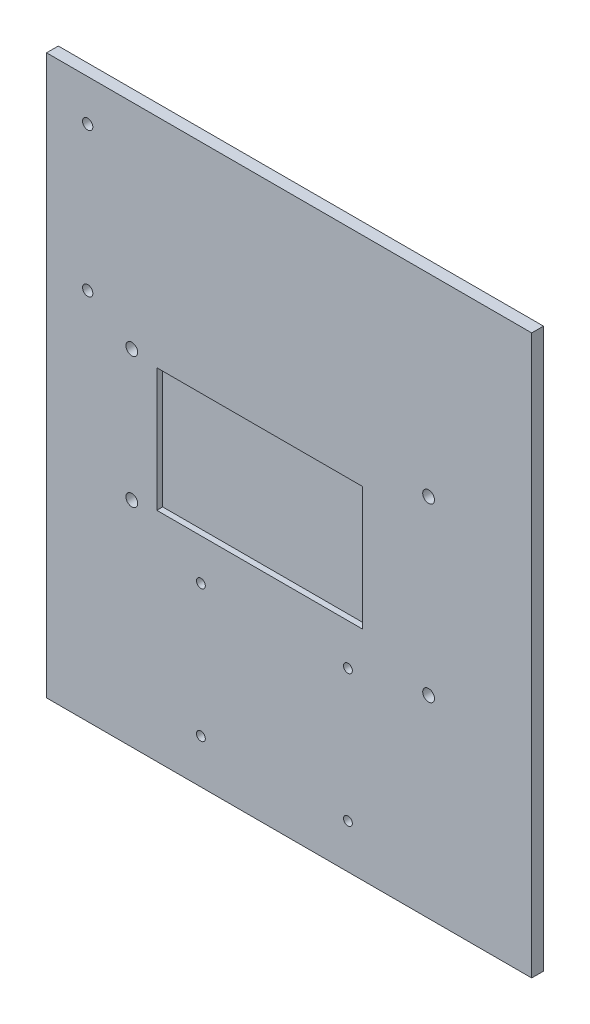
ISO-10303-21;
HEADER;
FILE_DESCRIPTION(('STEP AP214'),'2;1');
FILE_NAME('part.step','',(''),(''),'','','');
FILE_SCHEMA(('AUTOMOTIVE_DESIGN { 1 0 10303 214 1 1 1 1 }'));
ENDSEC;
DATA;
#1=APPLICATION_CONTEXT('core data for automotive mechanical design processes');
#2=APPLICATION_PROTOCOL_DEFINITION('international standard','automotive_design',2000,#1);
#3=PRODUCT_CONTEXT('',#1,'mechanical');
#4=PRODUCT('Part','Part','',(#3));
#5=PRODUCT_RELATED_PRODUCT_CATEGORY('part','',(#4));
#6=PRODUCT_DEFINITION_FORMATION('','',#4);
#7=PRODUCT_DEFINITION_CONTEXT('part definition',#1,'design');
#8=PRODUCT_DEFINITION('design','',#6,#7);
#9=PRODUCT_DEFINITION_SHAPE('','',#8);
#10=(LENGTH_UNIT() NAMED_UNIT(*) SI_UNIT(.MILLI.,.METRE.));
#11=(NAMED_UNIT(*) PLANE_ANGLE_UNIT() SI_UNIT($,.RADIAN.));
#12=(NAMED_UNIT(*) SI_UNIT($,.STERADIAN.) SOLID_ANGLE_UNIT());
#13=UNCERTAINTY_MEASURE_WITH_UNIT(LENGTH_MEASURE(1.E-05),#10,'distance_accuracy_value','');
#14=(GEOMETRIC_REPRESENTATION_CONTEXT(3) GLOBAL_UNCERTAINTY_ASSIGNED_CONTEXT((#13)) GLOBAL_UNIT_ASSIGNED_CONTEXT((#10,
#11,#12)) REPRESENTATION_CONTEXT('',''));
#15=CARTESIAN_POINT('',(0.,0.,0.));
#16=DIRECTION('',(0.,0.,1.));
#17=DIRECTION('',(1.,0.,0.));
#18=AXIS2_PLACEMENT_3D('',#15,#16,#17);
#19=CARTESIAN_POINT('',(0.,0.,4.));
#20=DIRECTION('',(1.,0.,0.));
#21=DIRECTION('',(0.,0.,-1.));
#22=AXIS2_PLACEMENT_3D('',#19,#20,#21);
#23=PLANE('',#22);
#24=DIRECTION('',(0.,-1.,0.));
#25=VECTOR('',#24,1.);
#26=CARTESIAN_POINT('',(0.,0.,0.));
#27=LINE('',#26,#25);
#28=CARTESIAN_POINT('',(0.,190.,0.));
#29=VERTEX_POINT('',#28);
#30=CARTESIAN_POINT('',(0.,0.,0.));
#31=VERTEX_POINT('',#30);
#32=EDGE_CURVE('E195',#29,#31,#27,.T.);
#33=ORIENTED_EDGE('',*,*,#32,.T.);
#34=DIRECTION('',(0.,0.,-1.));
#35=VECTOR('',#34,1.);
#36=CARTESIAN_POINT('',(0.,0.,4.));
#37=LINE('',#36,#35);
#38=CARTESIAN_POINT('',(0.,0.,4.));
#39=VERTEX_POINT('',#38);
#40=EDGE_CURVE('E11',#39,#31,#37,.T.);
#41=ORIENTED_EDGE('',*,*,#40,.F.);
#42=DIRECTION('',(0.,-1.,0.));
#43=VECTOR('',#42,1.);
#44=CARTESIAN_POINT('',(0.,0.,4.));
#45=LINE('',#44,#43);
#46=CARTESIAN_POINT('',(0.,190.,4.));
#47=VERTEX_POINT('',#46);
#48=EDGE_CURVE('E196',#47,#39,#45,.T.);
#49=ORIENTED_EDGE('',*,*,#48,.F.);
#50=DIRECTION('',(0.,0.,-1.));
#51=VECTOR('',#50,1.);
#52=CARTESIAN_POINT('',(0.,190.,4.));
#53=LINE('',#52,#51);
#54=EDGE_CURVE('E202',#47,#29,#53,.T.);
#55=ORIENTED_EDGE('',*,*,#54,.T.);
#56=EDGE_LOOP('',(#33,#41,#49,#55));
#57=FACE_BOUND('',#56,.T.);
#58=ADVANCED_FACE('F37',(#57),#23,.F.);
#59=CARTESIAN_POINT('',(0.,0.,4.));
#60=DIRECTION('',(0.,1.,0.));
#61=DIRECTION('',(0.,0.,1.));
#62=AXIS2_PLACEMENT_3D('',#59,#60,#61);
#63=PLANE('',#62);
#64=DIRECTION('',(1.,0.,0.));
#65=VECTOR('',#64,1.);
#66=CARTESIAN_POINT('',(0.,0.,0.));
#67=LINE('',#66,#65);
#68=CARTESIAN_POINT('',(165.,0.,0.));
#69=VERTEX_POINT('',#68);
#70=EDGE_CURVE('E205',#31,#69,#67,.T.);
#71=ORIENTED_EDGE('',*,*,#70,.T.);
#72=DIRECTION('',(0.,0.,-1.));
#73=VECTOR('',#72,1.);
#74=CARTESIAN_POINT('',(165.,0.,4.));
#75=LINE('',#74,#73);
#76=CARTESIAN_POINT('',(165.,0.,4.));
#77=VERTEX_POINT('',#76);
#78=EDGE_CURVE('E45',#77,#69,#75,.T.);
#79=ORIENTED_EDGE('',*,*,#78,.F.);
#80=DIRECTION('',(1.,0.,0.));
#81=VECTOR('',#80,1.);
#82=CARTESIAN_POINT('',(0.,0.,4.));
#83=LINE('',#82,#81);
#84=EDGE_CURVE('E90',#39,#77,#83,.T.);
#85=ORIENTED_EDGE('',*,*,#84,.F.);
#86=ORIENTED_EDGE('',*,*,#40,.T.);
#87=EDGE_LOOP('',(#71,#79,#85,#86));
#88=FACE_BOUND('',#87,.T.);
#89=ADVANCED_FACE('F266',(#88),#63,.F.);
#90=CARTESIAN_POINT('',(165.,0.,4.));
#91=DIRECTION('',(-1.,0.,0.));
#92=DIRECTION('',(0.,0.,1.));
#93=AXIS2_PLACEMENT_3D('',#90,#91,#92);
#94=PLANE('',#93);
#95=DIRECTION('',(0.,1.,0.));
#96=VECTOR('',#95,1.);
#97=CARTESIAN_POINT('',(165.,0.,0.));
#98=LINE('',#97,#96);
#99=CARTESIAN_POINT('',(165.,190.,0.));
#100=VERTEX_POINT('',#99);
#101=EDGE_CURVE('E207',#69,#100,#98,.T.);
#102=ORIENTED_EDGE('',*,*,#101,.T.);
#103=DIRECTION('',(0.,0.,-1.));
#104=VECTOR('',#103,1.);
#105=CARTESIAN_POINT('',(165.,190.,4.));
#106=LINE('',#105,#104);
#107=CARTESIAN_POINT('',(165.,190.,4.));
#108=VERTEX_POINT('',#107);
#109=EDGE_CURVE('E211',#108,#100,#106,.T.);
#110=ORIENTED_EDGE('',*,*,#109,.F.);
#111=DIRECTION('',(0.,1.,0.));
#112=VECTOR('',#111,1.);
#113=CARTESIAN_POINT('',(165.,0.,4.));
#114=LINE('',#113,#112);
#115=EDGE_CURVE('E199',#77,#108,#114,.T.);
#116=ORIENTED_EDGE('',*,*,#115,.F.);
#117=ORIENTED_EDGE('',*,*,#78,.T.);
#118=EDGE_LOOP('',(#102,#110,#116,#117));
#119=FACE_BOUND('',#118,.T.);
#120=ADVANCED_FACE('F265',(#119),#94,.F.);
#121=CARTESIAN_POINT('',(0.,190.,4.));
#122=DIRECTION('',(0.,-1.,0.));
#123=DIRECTION('',(0.,0.,-1.));
#124=AXIS2_PLACEMENT_3D('',#121,#122,#123);
#125=PLANE('',#124);
#126=DIRECTION('',(-1.,0.,0.));
#127=VECTOR('',#126,1.);
#128=CARTESIAN_POINT('',(0.,190.,0.));
#129=LINE('',#128,#127);
#130=EDGE_CURVE('E83',#100,#29,#129,.T.);
#131=ORIENTED_EDGE('',*,*,#130,.T.);
#132=ORIENTED_EDGE('',*,*,#54,.F.);
#133=DIRECTION('',(-1.,0.,0.));
#134=VECTOR('',#133,1.);
#135=CARTESIAN_POINT('',(0.,190.,4.));
#136=LINE('',#135,#134);
#137=EDGE_CURVE('E62',#108,#47,#136,.T.);
#138=ORIENTED_EDGE('',*,*,#137,.F.);
#139=ORIENTED_EDGE('',*,*,#109,.T.);
#140=EDGE_LOOP('',(#131,#132,#138,#139));
#141=FACE_BOUND('',#140,.T.);
#142=ADVANCED_FACE('F261',(#141),#125,.F.);
#143=CARTESIAN_POINT('',(0.,0.,4.));
#144=DIRECTION('',(0.,0.,-1.));
#145=DIRECTION('',(-1.,0.,0.));
#146=AXIS2_PLACEMENT_3D('',#143,#144,#145);
#147=PLANE('',#146);
#148=DIRECTION('',(1.,0.,0.));
#149=VECTOR('',#148,1.);
#150=CARTESIAN_POINT('',(37.5,74.,4.));
#151=LINE('',#150,#149);
#152=CARTESIAN_POINT('',(37.5,74.,4.));
#153=VERTEX_POINT('',#152);
#154=CARTESIAN_POINT('',(107.5,74.,4.));
#155=VERTEX_POINT('',#154);
#156=EDGE_CURVE('E141',#153,#155,#151,.T.);
#157=ORIENTED_EDGE('',*,*,#156,.F.);
#158=DIRECTION('',(0.,-1.,0.));
#159=VECTOR('',#158,1.);
#160=CARTESIAN_POINT('',(37.5,74.,4.));
#161=LINE('',#160,#159);
#162=CARTESIAN_POINT('',(37.5,116.,4.));
#163=VERTEX_POINT('',#162);
#164=EDGE_CURVE('E53',#163,#153,#161,.T.);
#165=ORIENTED_EDGE('',*,*,#164,.F.);
#166=DIRECTION('',(-1.,0.,0.));
#167=VECTOR('',#166,1.);
#168=CARTESIAN_POINT('',(37.5,116.,4.));
#169=LINE('',#168,#167);
#170=CARTESIAN_POINT('',(107.5,116.,4.));
#171=VERTEX_POINT('',#170);
#172=EDGE_CURVE('E132',#171,#163,#169,.T.);
#173=ORIENTED_EDGE('',*,*,#172,.F.);
#174=DIRECTION('',(0.,1.,0.));
#175=VECTOR('',#174,1.);
#176=CARTESIAN_POINT('',(107.5,74.,4.));
#177=LINE('',#176,#175);
#178=EDGE_CURVE('E135',#155,#171,#177,.T.);
#179=ORIENTED_EDGE('',*,*,#178,.F.);
#180=EDGE_LOOP('',(#157,#165,#173,#179));
#181=FACE_BOUND('',#180,.T.);
#182=CARTESIAN_POINT('',(102.5,15.,4.));
#183=DIRECTION('',(0.,0.,1.));
#184=DIRECTION('',(1.,0.,0.));
#185=AXIS2_PLACEMENT_3D('',#182,#183,#184);
#186=CIRCLE('',#185,1.5);
#187=CARTESIAN_POINT('',(104.,15.,4.));
#188=VERTEX_POINT('',#187);
#189=EDGE_CURVE('E147',#188,#188,#186,.T.);
#190=ORIENTED_EDGE('',*,*,#189,.F.);
#191=EDGE_LOOP('',(#190));
#192=FACE_BOUND('',#191,.T.);
#193=CARTESIAN_POINT('',(102.5,60.,4.));
#194=DIRECTION('',(0.,0.,1.));
#195=DIRECTION('',(1.,0.,0.));
#196=AXIS2_PLACEMENT_3D('',#193,#194,#195);
#197=CIRCLE('',#196,1.5);
#198=CARTESIAN_POINT('',(104.,60.,4.));
#199=VERTEX_POINT('',#198);
#200=EDGE_CURVE('E155',#199,#199,#197,.T.);
#201=ORIENTED_EDGE('',*,*,#200,.F.);
#202=EDGE_LOOP('',(#201));
#203=FACE_BOUND('',#202,.T.);
#204=CARTESIAN_POINT('',(52.5,60.,4.));
#205=DIRECTION('',(0.,0.,1.));
#206=DIRECTION('',(1.,0.,0.));
#207=AXIS2_PLACEMENT_3D('',#204,#205,#206);
#208=CIRCLE('',#207,1.5);
#209=CARTESIAN_POINT('',(54.,60.,4.));
#210=VERTEX_POINT('',#209);
#211=EDGE_CURVE('E151',#210,#210,#208,.T.);
#212=ORIENTED_EDGE('',*,*,#211,.F.);
#213=EDGE_LOOP('',(#212));
#214=FACE_BOUND('',#213,.T.);
#215=CARTESIAN_POINT('',(52.5,15.,4.));
#216=DIRECTION('',(0.,0.,1.));
#217=DIRECTION('',(1.,0.,0.));
#218=AXIS2_PLACEMENT_3D('',#215,#216,#217);
#219=CIRCLE('',#218,1.5);
#220=CARTESIAN_POINT('',(54.,15.,4.));
#221=VERTEX_POINT('',#220);
#222=EDGE_CURVE('E154',#221,#221,#219,.T.);
#223=ORIENTED_EDGE('',*,*,#222,.F.);
#224=EDGE_LOOP('',(#223));
#225=FACE_BOUND('',#224,.T.);
#226=CARTESIAN_POINT('',(14.,176.,4.));
#227=DIRECTION('',(0.,0.,1.));
#228=DIRECTION('',(1.,0.,0.));
#229=AXIS2_PLACEMENT_3D('',#226,#227,#228);
#230=CIRCLE('',#229,1.75000000000001);
#231=CARTESIAN_POINT('',(15.75,176.,4.));
#232=VERTEX_POINT('',#231);
#233=EDGE_CURVE('E163',#232,#232,#230,.T.);
#234=ORIENTED_EDGE('',*,*,#233,.F.);
#235=EDGE_LOOP('',(#234));
#236=FACE_BOUND('',#235,.T.);
#237=CARTESIAN_POINT('',(14.,127.,4.));
#238=DIRECTION('',(0.,0.,1.));
#239=DIRECTION('',(1.,0.,0.));
#240=AXIS2_PLACEMENT_3D('',#237,#238,#239);
#241=CIRCLE('',#240,1.75000000000001);
#242=CARTESIAN_POINT('',(15.75,127.,4.));
#243=VERTEX_POINT('',#242);
#244=EDGE_CURVE('E167',#243,#243,#241,.T.);
#245=ORIENTED_EDGE('',*,*,#244,.F.);
#246=EDGE_LOOP('',(#245));
#247=FACE_BOUND('',#246,.T.);
#248=CARTESIAN_POINT('',(129.934319196248,124.25,4.));
#249=DIRECTION('',(0.,0.,-1.));
#250=DIRECTION('',(-1.,0.,0.));
#251=AXIS2_PLACEMENT_3D('',#248,#249,#250);
#252=CIRCLE('',#251,2.);
#253=CARTESIAN_POINT('',(127.934319196248,124.25,4.));
#254=VERTEX_POINT('',#253);
#255=EDGE_CURVE('E192',#254,#254,#252,.T.);
#256=ORIENTED_EDGE('',*,*,#255,.T.);
#257=EDGE_LOOP('',(#256));
#258=FACE_BOUND('',#257,.T.);
#259=CARTESIAN_POINT('',(29.,117.25,4.));
#260=DIRECTION('',(0.,0.,-1.));
#261=DIRECTION('',(-1.,0.,0.));
#262=AXIS2_PLACEMENT_3D('',#259,#260,#261);
#263=CIRCLE('',#262,2.00000000000001);
#264=CARTESIAN_POINT('',(27.,117.25,4.));
#265=VERTEX_POINT('',#264);
#266=EDGE_CURVE('E189',#265,#265,#263,.T.);
#267=ORIENTED_EDGE('',*,*,#266,.T.);
#268=EDGE_LOOP('',(#267));
#269=FACE_BOUND('',#268,.T.);
#270=CARTESIAN_POINT('',(29.,72.75,4.));
#271=DIRECTION('',(0.,0.,-1.));
#272=DIRECTION('',(-1.,0.,0.));
#273=AXIS2_PLACEMENT_3D('',#270,#271,#272);
#274=CIRCLE('',#273,2.00000000000001);
#275=CARTESIAN_POINT('',(27.,72.75,4.));
#276=VERTEX_POINT('',#275);
#277=EDGE_CURVE('E186',#276,#276,#274,.T.);
#278=ORIENTED_EDGE('',*,*,#277,.T.);
#279=EDGE_LOOP('',(#278));
#280=FACE_BOUND('',#279,.T.);
#281=CARTESIAN_POINT('',(129.934319196248,65.75,4.));
#282=DIRECTION('',(0.,0.,-1.));
#283=DIRECTION('',(-1.,0.,0.));
#284=AXIS2_PLACEMENT_3D('',#281,#282,#283);
#285=CIRCLE('',#284,2.);
#286=CARTESIAN_POINT('',(127.934319196248,65.75,4.));
#287=VERTEX_POINT('',#286);
#288=EDGE_CURVE('E173',#287,#287,#285,.T.);
#289=ORIENTED_EDGE('',*,*,#288,.T.);
#290=EDGE_LOOP('',(#289));
#291=FACE_BOUND('',#290,.T.);
#292=ORIENTED_EDGE('',*,*,#48,.T.);
#293=ORIENTED_EDGE('',*,*,#84,.T.);
#294=ORIENTED_EDGE('',*,*,#115,.T.);
#295=ORIENTED_EDGE('',*,*,#137,.T.);
#296=EDGE_LOOP('',(#292,#293,#294,#295));
#297=FACE_BOUND('',#296,.T.);
#298=ADVANCED_FACE('F237',(#181,#192,#203,#214,#225,#236,#247,#258,#269,#280,#291,#297),#147,.F.);
#299=CARTESIAN_POINT('',(0.,0.,0.));
#300=DIRECTION('',(0.,0.,-1.));
#301=DIRECTION('',(-1.,0.,0.));
#302=AXIS2_PLACEMENT_3D('',#299,#300,#301);
#303=PLANE('',#302);
#304=CARTESIAN_POINT('',(102.5,15.,0.));
#305=DIRECTION('',(0.,0.,-1.));
#306=DIRECTION('',(-1.,0.,0.));
#307=AXIS2_PLACEMENT_3D('',#304,#305,#306);
#308=CIRCLE('',#307,1.5);
#309=CARTESIAN_POINT('',(101.,15.,0.));
#310=VERTEX_POINT('',#309);
#311=EDGE_CURVE('E40',#310,#310,#308,.T.);
#312=ORIENTED_EDGE('',*,*,#311,.F.);
#313=EDGE_LOOP('',(#312));
#314=FACE_BOUND('',#313,.T.);
#315=CARTESIAN_POINT('',(102.5,60.,0.));
#316=DIRECTION('',(0.,0.,-1.));
#317=DIRECTION('',(-1.,0.,0.));
#318=AXIS2_PLACEMENT_3D('',#315,#316,#317);
#319=CIRCLE('',#318,1.5);
#320=CARTESIAN_POINT('',(101.,60.,0.));
#321=VERTEX_POINT('',#320);
#322=EDGE_CURVE('E223',#321,#321,#319,.T.);
#323=ORIENTED_EDGE('',*,*,#322,.F.);
#324=EDGE_LOOP('',(#323));
#325=FACE_BOUND('',#324,.T.);
#326=CARTESIAN_POINT('',(52.5,60.,0.));
#327=DIRECTION('',(0.,0.,-1.));
#328=DIRECTION('',(-1.,0.,0.));
#329=AXIS2_PLACEMENT_3D('',#326,#327,#328);
#330=CIRCLE('',#329,1.5);
#331=CARTESIAN_POINT('',(51.,60.,0.));
#332=VERTEX_POINT('',#331);
#333=EDGE_CURVE('E221',#332,#332,#330,.T.);
#334=ORIENTED_EDGE('',*,*,#333,.F.);
#335=EDGE_LOOP('',(#334));
#336=FACE_BOUND('',#335,.T.);
#337=CARTESIAN_POINT('',(52.5,15.,0.));
#338=DIRECTION('',(0.,0.,-1.));
#339=DIRECTION('',(-1.,0.,0.));
#340=AXIS2_PLACEMENT_3D('',#337,#338,#339);
#341=CIRCLE('',#340,1.5);
#342=CARTESIAN_POINT('',(51.,15.,0.));
#343=VERTEX_POINT('',#342);
#344=EDGE_CURVE('E162',#343,#343,#341,.T.);
#345=ORIENTED_EDGE('',*,*,#344,.F.);
#346=EDGE_LOOP('',(#345));
#347=FACE_BOUND('',#346,.T.);
#348=CARTESIAN_POINT('',(14.,176.,0.));
#349=DIRECTION('',(0.,0.,-1.));
#350=DIRECTION('',(-1.,0.,0.));
#351=AXIS2_PLACEMENT_3D('',#348,#349,#350);
#352=CIRCLE('',#351,1.75000000000001);
#353=CARTESIAN_POINT('',(12.25,176.,0.));
#354=VERTEX_POINT('',#353);
#355=EDGE_CURVE('E183',#354,#354,#352,.T.);
#356=ORIENTED_EDGE('',*,*,#355,.F.);
#357=EDGE_LOOP('',(#356));
#358=FACE_BOUND('',#357,.T.);
#359=CARTESIAN_POINT('',(14.,127.,0.));
#360=DIRECTION('',(0.,0.,-1.));
#361=DIRECTION('',(-1.,0.,0.));
#362=AXIS2_PLACEMENT_3D('',#359,#360,#361);
#363=CIRCLE('',#362,1.75000000000001);
#364=CARTESIAN_POINT('',(12.25,127.,0.));
#365=VERTEX_POINT('',#364);
#366=EDGE_CURVE('E166',#365,#365,#363,.T.);
#367=ORIENTED_EDGE('',*,*,#366,.F.);
#368=EDGE_LOOP('',(#367));
#369=FACE_BOUND('',#368,.T.);
#370=CARTESIAN_POINT('',(129.934319196248,124.25,0.));
#371=DIRECTION('',(0.,0.,-1.));
#372=DIRECTION('',(-1.,0.,0.));
#373=AXIS2_PLACEMENT_3D('',#370,#371,#372);
#374=CIRCLE('',#373,2.);
#375=CARTESIAN_POINT('',(127.934319196248,124.25,0.));
#376=VERTEX_POINT('',#375);
#377=EDGE_CURVE('E170',#376,#376,#374,.T.);
#378=ORIENTED_EDGE('',*,*,#377,.F.);
#379=EDGE_LOOP('',(#378));
#380=FACE_BOUND('',#379,.T.);
#381=CARTESIAN_POINT('',(29.,117.25,0.));
#382=DIRECTION('',(0.,0.,-1.));
#383=DIRECTION('',(-1.,0.,0.));
#384=AXIS2_PLACEMENT_3D('',#381,#382,#383);
#385=CIRCLE('',#384,2.00000000000001);
#386=CARTESIAN_POINT('',(27.,117.25,0.));
#387=VERTEX_POINT('',#386);
#388=EDGE_CURVE('E174',#387,#387,#385,.T.);
#389=ORIENTED_EDGE('',*,*,#388,.F.);
#390=EDGE_LOOP('',(#389));
#391=FACE_BOUND('',#390,.T.);
#392=CARTESIAN_POINT('',(29.,72.75,0.));
#393=DIRECTION('',(0.,0.,-1.));
#394=DIRECTION('',(-1.,0.,0.));
#395=AXIS2_PLACEMENT_3D('',#392,#393,#394);
#396=CIRCLE('',#395,2.00000000000001);
#397=CARTESIAN_POINT('',(27.,72.75,0.));
#398=VERTEX_POINT('',#397);
#399=EDGE_CURVE('E177',#398,#398,#396,.T.);
#400=ORIENTED_EDGE('',*,*,#399,.F.);
#401=EDGE_LOOP('',(#400));
#402=FACE_BOUND('',#401,.T.);
#403=CARTESIAN_POINT('',(129.934319196248,65.75,0.));
#404=DIRECTION('',(0.,0.,-1.));
#405=DIRECTION('',(-1.,0.,0.));
#406=AXIS2_PLACEMENT_3D('',#403,#404,#405);
#407=CIRCLE('',#406,2.);
#408=CARTESIAN_POINT('',(127.934319196248,65.75,0.));
#409=VERTEX_POINT('',#408);
#410=EDGE_CURVE('E180',#409,#409,#407,.T.);
#411=ORIENTED_EDGE('',*,*,#410,.F.);
#412=EDGE_LOOP('',(#411));
#413=FACE_BOUND('',#412,.T.);
#414=ORIENTED_EDGE('',*,*,#32,.F.);
#415=ORIENTED_EDGE('',*,*,#130,.F.);
#416=ORIENTED_EDGE('',*,*,#101,.F.);
#417=ORIENTED_EDGE('',*,*,#70,.F.);
#418=EDGE_LOOP('',(#414,#415,#416,#417));
#419=FACE_BOUND('',#418,.T.);
#420=ADVANCED_FACE('F233',(#314,#325,#336,#347,#358,#369,#380,#391,#402,#413,#419),#303,.T.);
#421=CARTESIAN_POINT('',(129.934319196248,65.75,10.));
#422=DIRECTION('',(0.,0.,-1.));
#423=DIRECTION('',(-1.,0.,0.));
#424=AXIS2_PLACEMENT_3D('',#421,#422,#423);
#425=CYLINDRICAL_SURFACE('',#424,2.);
#426=ORIENTED_EDGE('',*,*,#410,.T.);
#427=EDGE_LOOP('',(#426));
#428=FACE_BOUND('',#427,.T.);
#429=ORIENTED_EDGE('',*,*,#288,.F.);
#430=EDGE_LOOP('',(#429));
#431=FACE_BOUND('',#430,.T.);
#432=ADVANCED_FACE('F236',(#428,#431),#425,.F.);
#433=CARTESIAN_POINT('',(29.,72.75,10.));
#434=DIRECTION('',(0.,0.,-1.));
#435=DIRECTION('',(-1.,0.,0.));
#436=AXIS2_PLACEMENT_3D('',#433,#434,#435);
#437=CYLINDRICAL_SURFACE('',#436,2.00000000000001);
#438=ORIENTED_EDGE('',*,*,#399,.T.);
#439=EDGE_LOOP('',(#438));
#440=FACE_BOUND('',#439,.T.);
#441=ORIENTED_EDGE('',*,*,#277,.F.);
#442=EDGE_LOOP('',(#441));
#443=FACE_BOUND('',#442,.T.);
#444=ADVANCED_FACE('F281',(#440,#443),#437,.F.);
#445=CARTESIAN_POINT('',(29.,117.25,10.));
#446=DIRECTION('',(0.,0.,-1.));
#447=DIRECTION('',(-1.,0.,0.));
#448=AXIS2_PLACEMENT_3D('',#445,#446,#447);
#449=CYLINDRICAL_SURFACE('',#448,2.00000000000001);
#450=ORIENTED_EDGE('',*,*,#388,.T.);
#451=EDGE_LOOP('',(#450));
#452=FACE_BOUND('',#451,.T.);
#453=ORIENTED_EDGE('',*,*,#266,.F.);
#454=EDGE_LOOP('',(#453));
#455=FACE_BOUND('',#454,.T.);
#456=ADVANCED_FACE('F285',(#452,#455),#449,.F.);
#457=CARTESIAN_POINT('',(129.934319196248,124.25,10.));
#458=DIRECTION('',(0.,0.,-1.));
#459=DIRECTION('',(-1.,0.,0.));
#460=AXIS2_PLACEMENT_3D('',#457,#458,#459);
#461=CYLINDRICAL_SURFACE('',#460,2.);
#462=ORIENTED_EDGE('',*,*,#377,.T.);
#463=EDGE_LOOP('',(#462));
#464=FACE_BOUND('',#463,.T.);
#465=ORIENTED_EDGE('',*,*,#255,.F.);
#466=EDGE_LOOP('',(#465));
#467=FACE_BOUND('',#466,.T.);
#468=ADVANCED_FACE('F289',(#464,#467),#461,.F.);
#469=CARTESIAN_POINT('',(14.,127.,-6.));
#470=DIRECTION('',(0.,0.,1.));
#471=DIRECTION('',(1.,0.,0.));
#472=AXIS2_PLACEMENT_3D('',#469,#470,#471);
#473=CYLINDRICAL_SURFACE('',#472,1.75000000000001);
#474=ORIENTED_EDGE('',*,*,#366,.T.);
#475=EDGE_LOOP('',(#474));
#476=FACE_BOUND('',#475,.T.);
#477=ORIENTED_EDGE('',*,*,#244,.T.);
#478=EDGE_LOOP('',(#477));
#479=FACE_BOUND('',#478,.T.);
#480=ADVANCED_FACE('F293',(#476,#479),#473,.F.);
#481=CARTESIAN_POINT('',(14.,176.,-6.));
#482=DIRECTION('',(0.,0.,1.));
#483=DIRECTION('',(1.,0.,0.));
#484=AXIS2_PLACEMENT_3D('',#481,#482,#483);
#485=CYLINDRICAL_SURFACE('',#484,1.75000000000001);
#486=ORIENTED_EDGE('',*,*,#355,.T.);
#487=EDGE_LOOP('',(#486));
#488=FACE_BOUND('',#487,.T.);
#489=ORIENTED_EDGE('',*,*,#233,.T.);
#490=EDGE_LOOP('',(#489));
#491=FACE_BOUND('',#490,.T.);
#492=ADVANCED_FACE('F297',(#488,#491),#485,.F.);
#493=CARTESIAN_POINT('',(52.5,15.,-6.));
#494=DIRECTION('',(0.,0.,1.));
#495=DIRECTION('',(1.,0.,0.));
#496=AXIS2_PLACEMENT_3D('',#493,#494,#495);
#497=CYLINDRICAL_SURFACE('',#496,1.5);
#498=ORIENTED_EDGE('',*,*,#344,.T.);
#499=EDGE_LOOP('',(#498));
#500=FACE_BOUND('',#499,.T.);
#501=ORIENTED_EDGE('',*,*,#222,.T.);
#502=EDGE_LOOP('',(#501));
#503=FACE_BOUND('',#502,.T.);
#504=ADVANCED_FACE('F301',(#500,#503),#497,.F.);
#505=CARTESIAN_POINT('',(52.5,60.,-6.));
#506=DIRECTION('',(0.,0.,1.));
#507=DIRECTION('',(1.,0.,0.));
#508=AXIS2_PLACEMENT_3D('',#505,#506,#507);
#509=CYLINDRICAL_SURFACE('',#508,1.5);
#510=ORIENTED_EDGE('',*,*,#333,.T.);
#511=EDGE_LOOP('',(#510));
#512=FACE_BOUND('',#511,.T.);
#513=ORIENTED_EDGE('',*,*,#211,.T.);
#514=EDGE_LOOP('',(#513));
#515=FACE_BOUND('',#514,.T.);
#516=ADVANCED_FACE('F305',(#512,#515),#509,.F.);
#517=CARTESIAN_POINT('',(102.5,60.,-6.));
#518=DIRECTION('',(0.,0.,1.));
#519=DIRECTION('',(1.,0.,0.));
#520=AXIS2_PLACEMENT_3D('',#517,#518,#519);
#521=CYLINDRICAL_SURFACE('',#520,1.5);
#522=ORIENTED_EDGE('',*,*,#322,.T.);
#523=EDGE_LOOP('',(#522));
#524=FACE_BOUND('',#523,.T.);
#525=ORIENTED_EDGE('',*,*,#200,.T.);
#526=EDGE_LOOP('',(#525));
#527=FACE_BOUND('',#526,.T.);
#528=ADVANCED_FACE('F309',(#524,#527),#521,.F.);
#529=CARTESIAN_POINT('',(102.5,15.,-6.));
#530=DIRECTION('',(0.,0.,1.));
#531=DIRECTION('',(1.,0.,0.));
#532=AXIS2_PLACEMENT_3D('',#529,#530,#531);
#533=CYLINDRICAL_SURFACE('',#532,1.5);
#534=ORIENTED_EDGE('',*,*,#311,.T.);
#535=EDGE_LOOP('',(#534));
#536=FACE_BOUND('',#535,.T.);
#537=ORIENTED_EDGE('',*,*,#189,.T.);
#538=EDGE_LOOP('',(#537));
#539=FACE_BOUND('',#538,.T.);
#540=ADVANCED_FACE('F230',(#536,#539),#533,.F.);
#541=CARTESIAN_POINT('',(37.5,74.,2.));
#542=DIRECTION('',(-1.,0.,0.));
#543=DIRECTION('',(0.,-1.,0.));
#544=AXIS2_PLACEMENT_3D('',#541,#542,#543);
#545=PLANE('',#544);
#546=ORIENTED_EDGE('',*,*,#164,.T.);
#547=DIRECTION('',(0.,0.,1.));
#548=VECTOR('',#547,1.);
#549=CARTESIAN_POINT('',(37.5,74.,2.));
#550=LINE('',#549,#548);
#551=CARTESIAN_POINT('',(37.5,74.,2.));
#552=VERTEX_POINT('',#551);
#553=EDGE_CURVE('E110',#552,#153,#550,.T.);
#554=ORIENTED_EDGE('',*,*,#553,.F.);
#555=DIRECTION('',(0.,-1.,0.));
#556=VECTOR('',#555,1.);
#557=CARTESIAN_POINT('',(37.5,74.,2.));
#558=LINE('',#557,#556);
#559=CARTESIAN_POINT('',(37.5,116.,2.));
#560=VERTEX_POINT('',#559);
#561=EDGE_CURVE('E114',#560,#552,#558,.T.);
#562=ORIENTED_EDGE('',*,*,#561,.F.);
#563=DIRECTION('',(0.,0.,1.));
#564=VECTOR('',#563,1.);
#565=CARTESIAN_POINT('',(37.5,116.,2.));
#566=LINE('',#565,#564);
#567=EDGE_CURVE('E145',#560,#163,#566,.T.);
#568=ORIENTED_EDGE('',*,*,#567,.T.);
#569=EDGE_LOOP('',(#546,#554,#562,#568));
#570=FACE_BOUND('',#569,.T.);
#571=ADVANCED_FACE('F112',(#570),#545,.F.);
#572=CARTESIAN_POINT('',(37.5,116.,2.));
#573=DIRECTION('',(0.,1.,0.));
#574=DIRECTION('',(0.,0.,1.));
#575=AXIS2_PLACEMENT_3D('',#572,#573,#574);
#576=PLANE('',#575);
#577=ORIENTED_EDGE('',*,*,#172,.T.);
#578=ORIENTED_EDGE('',*,*,#567,.F.);
#579=DIRECTION('',(-1.,0.,0.));
#580=VECTOR('',#579,1.);
#581=CARTESIAN_POINT('',(37.5,116.,2.));
#582=LINE('',#581,#580);
#583=CARTESIAN_POINT('',(107.5,116.,2.));
#584=VERTEX_POINT('',#583);
#585=EDGE_CURVE('E120',#584,#560,#582,.T.);
#586=ORIENTED_EDGE('',*,*,#585,.F.);
#587=DIRECTION('',(0.,0.,1.));
#588=VECTOR('',#587,1.);
#589=CARTESIAN_POINT('',(107.5,116.,2.));
#590=LINE('',#589,#588);
#591=EDGE_CURVE('E148',#584,#171,#590,.T.);
#592=ORIENTED_EDGE('',*,*,#591,.T.);
#593=EDGE_LOOP('',(#577,#578,#586,#592));
#594=FACE_BOUND('',#593,.T.);
#595=ADVANCED_FACE('F317',(#594),#576,.F.);
#596=CARTESIAN_POINT('',(107.5,74.,2.));
#597=DIRECTION('',(1.,0.,0.));
#598=DIRECTION('',(0.,0.,-1.));
#599=AXIS2_PLACEMENT_3D('',#596,#597,#598);
#600=PLANE('',#599);
#601=ORIENTED_EDGE('',*,*,#178,.T.);
#602=ORIENTED_EDGE('',*,*,#591,.F.);
#603=DIRECTION('',(0.,1.,0.));
#604=VECTOR('',#603,1.);
#605=CARTESIAN_POINT('',(107.5,74.,2.));
#606=LINE('',#605,#604);
#607=CARTESIAN_POINT('',(107.5,74.,2.));
#608=VERTEX_POINT('',#607);
#609=EDGE_CURVE('E128',#608,#584,#606,.T.);
#610=ORIENTED_EDGE('',*,*,#609,.F.);
#611=DIRECTION('',(0.,0.,1.));
#612=VECTOR('',#611,1.);
#613=CARTESIAN_POINT('',(107.5,74.,2.));
#614=LINE('',#613,#612);
#615=EDGE_CURVE('E119',#608,#155,#614,.T.);
#616=ORIENTED_EDGE('',*,*,#615,.T.);
#617=EDGE_LOOP('',(#601,#602,#610,#616));
#618=FACE_BOUND('',#617,.T.);
#619=ADVANCED_FACE('F320',(#618),#600,.F.);
#620=CARTESIAN_POINT('',(37.5,74.,2.));
#621=DIRECTION('',(0.,-1.,0.));
#622=DIRECTION('',(0.,0.,-1.));
#623=AXIS2_PLACEMENT_3D('',#620,#621,#622);
#624=PLANE('',#623);
#625=ORIENTED_EDGE('',*,*,#156,.T.);
#626=ORIENTED_EDGE('',*,*,#615,.F.);
#627=DIRECTION('',(1.,0.,0.));
#628=VECTOR('',#627,1.);
#629=CARTESIAN_POINT('',(37.5,74.,2.));
#630=LINE('',#629,#628);
#631=EDGE_CURVE('E123',#552,#608,#630,.T.);
#632=ORIENTED_EDGE('',*,*,#631,.F.);
#633=ORIENTED_EDGE('',*,*,#553,.T.);
#634=EDGE_LOOP('',(#625,#626,#632,#633));
#635=FACE_BOUND('',#634,.T.);
#636=ADVANCED_FACE('F124',(#635),#624,.F.);
#637=CARTESIAN_POINT('',(0.,0.,2.));
#638=DIRECTION('',(0.,0.,-1.));
#639=DIRECTION('',(-1.,0.,0.));
#640=AXIS2_PLACEMENT_3D('',#637,#638,#639);
#641=PLANE('',#640);
#642=ORIENTED_EDGE('',*,*,#561,.T.);
#643=ORIENTED_EDGE('',*,*,#631,.T.);
#644=ORIENTED_EDGE('',*,*,#609,.T.);
#645=ORIENTED_EDGE('',*,*,#585,.T.);
#646=EDGE_LOOP('',(#642,#643,#644,#645));
#647=FACE_BOUND('',#646,.T.);
#648=ADVANCED_FACE('F130',(#647),#641,.F.);
#649=CLOSED_SHELL('',(#58,#89,#120,#142,#298,#420,#432,#444,#456,#468,#480,#492,#504,#516,#528,
#540,#571,#595,#619,#636,#648));
#650=MANIFOLD_SOLID_BREP('B2',#649);
#651=ADVANCED_BREP_SHAPE_REPRESENTATION('',(#18,#650),#14);
#652=SHAPE_DEFINITION_REPRESENTATION(#9,#651);
ENDSEC;
END-ISO-10303-21;
